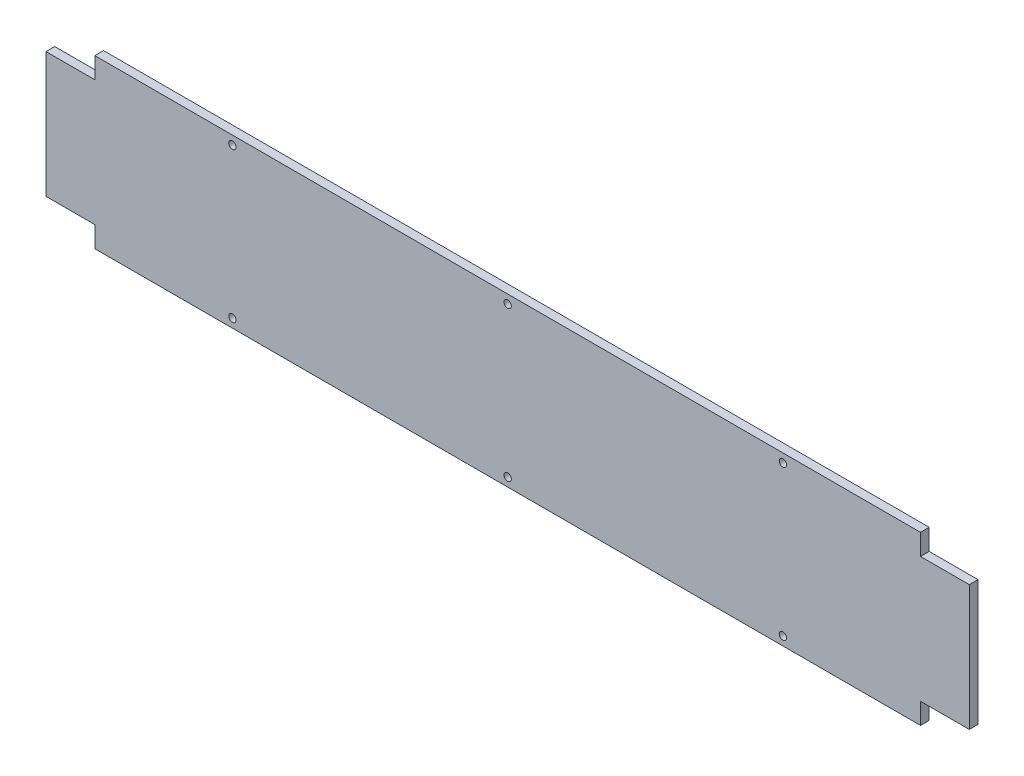
ISO-10303-21;
HEADER;
FILE_DESCRIPTION(('STEP AP214'),'2;1');
FILE_NAME('part.step','',(''),(''),'','','');
FILE_SCHEMA(('AUTOMOTIVE_DESIGN { 1 0 10303 214 1 1 1 1 }'));
ENDSEC;
DATA;
#1=APPLICATION_CONTEXT('core data for automotive mechanical design processes');
#2=APPLICATION_PROTOCOL_DEFINITION('international standard','automotive_design',2000,#1);
#3=PRODUCT_CONTEXT('',#1,'mechanical');
#4=PRODUCT('Part','Part','',(#3));
#5=PRODUCT_RELATED_PRODUCT_CATEGORY('part','',(#4));
#6=PRODUCT_DEFINITION_FORMATION('','',#4);
#7=PRODUCT_DEFINITION_CONTEXT('part definition',#1,'design');
#8=PRODUCT_DEFINITION('design','',#6,#7);
#9=PRODUCT_DEFINITION_SHAPE('','',#8);
#10=(LENGTH_UNIT() NAMED_UNIT(*) SI_UNIT(.MILLI.,.METRE.));
#11=(NAMED_UNIT(*) PLANE_ANGLE_UNIT() SI_UNIT($,.RADIAN.));
#12=(NAMED_UNIT(*) SI_UNIT($,.STERADIAN.) SOLID_ANGLE_UNIT());
#13=UNCERTAINTY_MEASURE_WITH_UNIT(LENGTH_MEASURE(1.E-05),#10,'distance_accuracy_value','');
#14=(GEOMETRIC_REPRESENTATION_CONTEXT(3) GLOBAL_UNCERTAINTY_ASSIGNED_CONTEXT((#13)) GLOBAL_UNIT_ASSIGNED_CONTEXT((#10,
#11,#12)) REPRESENTATION_CONTEXT('',''));
#15=CARTESIAN_POINT('',(0.,0.,0.));
#16=DIRECTION('',(0.,0.,1.));
#17=DIRECTION('',(1.,0.,0.));
#18=AXIS2_PLACEMENT_3D('',#15,#16,#17);
#19=CARTESIAN_POINT('',(0.,0.,5.));
#20=DIRECTION('',(1.,0.,0.));
#21=DIRECTION('',(0.,0.,-1.));
#22=AXIS2_PLACEMENT_3D('',#19,#20,#21);
#23=PLANE('',#22);
#24=DIRECTION('',(0.,0.,1.));
#25=VECTOR('',#24,1.);
#26=CARTESIAN_POINT('',(0.,12.,0.));
#27=LINE('',#26,#25);
#28=CARTESIAN_POINT('',(0.,12.,0.));
#29=VERTEX_POINT('',#28);
#30=CARTESIAN_POINT('',(0.,12.,5.));
#31=VERTEX_POINT('',#30);
#32=EDGE_CURVE('E135',#29,#31,#27,.T.);
#33=ORIENTED_EDGE('',*,*,#32,.F.);
#34=DIRECTION('',(0.,-1.,0.));
#35=VECTOR('',#34,1.);
#36=CARTESIAN_POINT('',(0.,0.,0.));
#37=LINE('',#36,#35);
#38=CARTESIAN_POINT('',(0.,0.,0.));
#39=VERTEX_POINT('',#38);
#40=EDGE_CURVE('E188',#29,#39,#37,.T.);
#41=ORIENTED_EDGE('',*,*,#40,.T.);
#42=DIRECTION('',(0.,0.,-1.));
#43=VECTOR('',#42,1.);
#44=CARTESIAN_POINT('',(0.,0.,5.));
#45=LINE('',#44,#43);
#46=CARTESIAN_POINT('',(0.,0.,5.));
#47=VERTEX_POINT('',#46);
#48=EDGE_CURVE('E11',#47,#39,#45,.T.);
#49=ORIENTED_EDGE('',*,*,#48,.F.);
#50=DIRECTION('',(0.,-1.,0.));
#51=VECTOR('',#50,1.);
#52=CARTESIAN_POINT('',(0.,0.,5.));
#53=LINE('',#52,#51);
#54=EDGE_CURVE('E151',#31,#47,#53,.T.);
#55=ORIENTED_EDGE('',*,*,#54,.F.);
#56=EDGE_LOOP('',(#33,#41,#49,#55));
#57=FACE_BOUND('',#56,.T.);
#58=ADVANCED_FACE('F45',(#57),#23,.F.);
#59=CARTESIAN_POINT('',(474.,0.,5.));
#60=DIRECTION('',(-1.,0.,0.));
#61=DIRECTION('',(0.,0.,1.));
#62=AXIS2_PLACEMENT_3D('',#59,#60,#61);
#63=PLANE('',#62);
#64=DIRECTION('',(0.,0.,1.));
#65=VECTOR('',#64,1.);
#66=CARTESIAN_POINT('',(474.,84.,0.));
#67=LINE('',#66,#65);
#68=CARTESIAN_POINT('',(474.,84.,0.));
#69=VERTEX_POINT('',#68);
#70=CARTESIAN_POINT('',(474.,84.,5.));
#71=VERTEX_POINT('',#70);
#72=EDGE_CURVE('E241',#69,#71,#67,.T.);
#73=ORIENTED_EDGE('',*,*,#72,.F.);
#74=DIRECTION('',(0.,1.,0.));
#75=VECTOR('',#74,1.);
#76=CARTESIAN_POINT('',(474.,0.,0.));
#77=LINE('',#76,#75);
#78=CARTESIAN_POINT('',(474.,96.,0.));
#79=VERTEX_POINT('',#78);
#80=EDGE_CURVE('E191',#69,#79,#77,.T.);
#81=ORIENTED_EDGE('',*,*,#80,.T.);
#82=DIRECTION('',(0.,0.,-1.));
#83=VECTOR('',#82,1.);
#84=CARTESIAN_POINT('',(474.,96.,5.));
#85=LINE('',#84,#83);
#86=CARTESIAN_POINT('',(474.,96.,5.));
#87=VERTEX_POINT('',#86);
#88=EDGE_CURVE('E198',#87,#79,#85,.T.);
#89=ORIENTED_EDGE('',*,*,#88,.F.);
#90=DIRECTION('',(0.,1.,0.));
#91=VECTOR('',#90,1.);
#92=CARTESIAN_POINT('',(474.,0.,5.));
#93=LINE('',#92,#91);
#94=EDGE_CURVE('E174',#71,#87,#93,.T.);
#95=ORIENTED_EDGE('',*,*,#94,.F.);
#96=EDGE_LOOP('',(#73,#81,#89,#95));
#97=FACE_BOUND('',#96,.T.);
#98=ADVANCED_FACE('F320',(#97),#63,.F.);
#99=CARTESIAN_POINT('',(0.,96.,0.));
#100=VERTEX_POINT('',#99);
#101=CARTESIAN_POINT('',(0.,84.,0.));
#102=VERTEX_POINT('',#101);
#103=EDGE_CURVE('E183',#100,#102,#37,.T.);
#104=ORIENTED_EDGE('',*,*,#103,.T.);
#105=DIRECTION('',(0.,0.,1.));
#106=VECTOR('',#105,1.);
#107=CARTESIAN_POINT('',(0.,84.,0.));
#108=LINE('',#107,#106);
#109=CARTESIAN_POINT('',(0.,84.,5.));
#110=VERTEX_POINT('',#109);
#111=EDGE_CURVE('E334',#102,#110,#108,.T.);
#112=ORIENTED_EDGE('',*,*,#111,.T.);
#113=CARTESIAN_POINT('',(0.,96.,5.));
#114=VERTEX_POINT('',#113);
#115=EDGE_CURVE('E160',#114,#110,#53,.T.);
#116=ORIENTED_EDGE('',*,*,#115,.F.);
#117=DIRECTION('',(0.,0.,-1.));
#118=VECTOR('',#117,1.);
#119=CARTESIAN_POINT('',(0.,96.,5.));
#120=LINE('',#119,#118);
#121=EDGE_CURVE('E182',#114,#100,#120,.T.);
#122=ORIENTED_EDGE('',*,*,#121,.T.);
#123=EDGE_LOOP('',(#104,#112,#116,#122));
#124=FACE_BOUND('',#123,.T.);
#125=ADVANCED_FACE('F47',(#124),#23,.F.);
#126=CARTESIAN_POINT('',(0.,0.,5.));
#127=DIRECTION('',(0.,1.,0.));
#128=DIRECTION('',(0.,0.,1.));
#129=AXIS2_PLACEMENT_3D('',#126,#127,#128);
#130=PLANE('',#129);
#131=DIRECTION('',(1.,0.,0.));
#132=VECTOR('',#131,1.);
#133=CARTESIAN_POINT('',(0.,0.,0.));
#134=LINE('',#133,#132);
#135=CARTESIAN_POINT('',(474.,0.,0.));
#136=VERTEX_POINT('',#135);
#137=EDGE_CURVE('E187',#39,#136,#134,.T.);
#138=ORIENTED_EDGE('',*,*,#137,.T.);
#139=DIRECTION('',(0.,0.,-1.));
#140=VECTOR('',#139,1.);
#141=CARTESIAN_POINT('',(474.,0.,5.));
#142=LINE('',#141,#140);
#143=CARTESIAN_POINT('',(474.,0.,5.));
#144=VERTEX_POINT('',#143);
#145=EDGE_CURVE('E54',#144,#136,#142,.T.);
#146=ORIENTED_EDGE('',*,*,#145,.F.);
#147=DIRECTION('',(1.,0.,0.));
#148=VECTOR('',#147,1.);
#149=CARTESIAN_POINT('',(0.,0.,5.));
#150=LINE('',#149,#148);
#151=EDGE_CURVE('E165',#47,#144,#150,.T.);
#152=ORIENTED_EDGE('',*,*,#151,.F.);
#153=ORIENTED_EDGE('',*,*,#48,.T.);
#154=EDGE_LOOP('',(#138,#146,#152,#153));
#155=FACE_BOUND('',#154,.T.);
#156=ADVANCED_FACE('F328',(#155),#130,.F.);
#157=CARTESIAN_POINT('',(474.,12.,0.));
#158=VERTEX_POINT('',#157);
#159=EDGE_CURVE('E166',#136,#158,#77,.T.);
#160=ORIENTED_EDGE('',*,*,#159,.T.);
#161=DIRECTION('',(0.,0.,1.));
#162=VECTOR('',#161,1.);
#163=CARTESIAN_POINT('',(474.,12.,0.));
#164=LINE('',#163,#162);
#165=CARTESIAN_POINT('',(474.,12.,5.));
#166=VERTEX_POINT('',#165);
#167=EDGE_CURVE('E235',#158,#166,#164,.T.);
#168=ORIENTED_EDGE('',*,*,#167,.T.);
#169=EDGE_CURVE('E175',#144,#166,#93,.T.);
#170=ORIENTED_EDGE('',*,*,#169,.F.);
#171=ORIENTED_EDGE('',*,*,#145,.T.);
#172=EDGE_LOOP('',(#160,#168,#170,#171));
#173=FACE_BOUND('',#172,.T.);
#174=ADVANCED_FACE('F207',(#173),#63,.F.);
#175=CARTESIAN_POINT('',(0.,96.,5.));
#176=DIRECTION('',(0.,-1.,0.));
#177=DIRECTION('',(0.,0.,-1.));
#178=AXIS2_PLACEMENT_3D('',#175,#176,#177);
#179=PLANE('',#178);
#180=DIRECTION('',(-1.,0.,0.));
#181=VECTOR('',#180,1.);
#182=CARTESIAN_POINT('',(0.,96.,0.));
#183=LINE('',#182,#181);
#184=EDGE_CURVE('E161',#79,#100,#183,.T.);
#185=ORIENTED_EDGE('',*,*,#184,.T.);
#186=ORIENTED_EDGE('',*,*,#121,.F.);
#187=DIRECTION('',(-1.,0.,0.));
#188=VECTOR('',#187,1.);
#189=CARTESIAN_POINT('',(0.,96.,5.));
#190=LINE('',#189,#188);
#191=EDGE_CURVE('E179',#87,#114,#190,.T.);
#192=ORIENTED_EDGE('',*,*,#191,.F.);
#193=ORIENTED_EDGE('',*,*,#88,.T.);
#194=EDGE_LOOP('',(#185,#186,#192,#193));
#195=FACE_BOUND('',#194,.T.);
#196=ADVANCED_FACE('F304',(#195),#179,.F.);
#197=CARTESIAN_POINT('',(0.,0.,5.));
#198=DIRECTION('',(0.,0.,-1.));
#199=DIRECTION('',(-1.,0.,0.));
#200=AXIS2_PLACEMENT_3D('',#197,#198,#199);
#201=PLANE('',#200);
#202=CARTESIAN_POINT('',(79.,5.,5.));
#203=DIRECTION('',(0.,0.,1.));
#204=DIRECTION('',(-1.,0.,0.));
#205=AXIS2_PLACEMENT_3D('',#202,#203,#204);
#206=CIRCLE('',#205,2.09999999999999);
#207=CARTESIAN_POINT('',(76.9,5.,5.));
#208=VERTEX_POINT('',#207);
#209=EDGE_CURVE('E285',#208,#208,#206,.T.);
#210=ORIENTED_EDGE('',*,*,#209,.F.);
#211=EDGE_LOOP('',(#210));
#212=FACE_BOUND('',#211,.T.);
#213=CARTESIAN_POINT('',(237.,5.,5.));
#214=DIRECTION('',(0.,0.,1.));
#215=DIRECTION('',(-1.,0.,0.));
#216=AXIS2_PLACEMENT_3D('',#213,#214,#215);
#217=CIRCLE('',#216,2.10000000000002);
#218=CARTESIAN_POINT('',(234.9,5.,5.));
#219=VERTEX_POINT('',#218);
#220=EDGE_CURVE('E277',#219,#219,#217,.T.);
#221=ORIENTED_EDGE('',*,*,#220,.F.);
#222=EDGE_LOOP('',(#221));
#223=FACE_BOUND('',#222,.T.);
#224=CARTESIAN_POINT('',(395.,5.,5.));
#225=DIRECTION('',(0.,0.,1.));
#226=DIRECTION('',(-1.,0.,0.));
#227=AXIS2_PLACEMENT_3D('',#224,#225,#226);
#228=CIRCLE('',#227,2.09999999999999);
#229=CARTESIAN_POINT('',(392.9,5.,5.));
#230=VERTEX_POINT('',#229);
#231=EDGE_CURVE('E269',#230,#230,#228,.T.);
#232=ORIENTED_EDGE('',*,*,#231,.F.);
#233=EDGE_LOOP('',(#232));
#234=FACE_BOUND('',#233,.T.);
#235=CARTESIAN_POINT('',(395.,91.,5.));
#236=DIRECTION('',(0.,0.,1.));
#237=DIRECTION('',(1.,0.,0.));
#238=AXIS2_PLACEMENT_3D('',#235,#236,#237);
#239=CIRCLE('',#238,2.09999999999999);
#240=CARTESIAN_POINT('',(397.1,91.,5.));
#241=VERTEX_POINT('',#240);
#242=EDGE_CURVE('E261',#241,#241,#239,.T.);
#243=ORIENTED_EDGE('',*,*,#242,.F.);
#244=EDGE_LOOP('',(#243));
#245=FACE_BOUND('',#244,.T.);
#246=CARTESIAN_POINT('',(237.,91.,5.));
#247=DIRECTION('',(0.,0.,1.));
#248=DIRECTION('',(1.,0.,0.));
#249=AXIS2_PLACEMENT_3D('',#246,#247,#248);
#250=CIRCLE('',#249,2.10000000000002);
#251=CARTESIAN_POINT('',(239.1,91.,5.));
#252=VERTEX_POINT('',#251);
#253=EDGE_CURVE('E253',#252,#252,#250,.T.);
#254=ORIENTED_EDGE('',*,*,#253,.F.);
#255=EDGE_LOOP('',(#254));
#256=FACE_BOUND('',#255,.T.);
#257=CARTESIAN_POINT('',(79.,91.,5.));
#258=DIRECTION('',(0.,0.,1.));
#259=DIRECTION('',(1.,0.,0.));
#260=AXIS2_PLACEMENT_3D('',#257,#258,#259);
#261=CIRCLE('',#260,2.09999999999999);
#262=CARTESIAN_POINT('',(81.1,91.,5.));
#263=VERTEX_POINT('',#262);
#264=EDGE_CURVE('E170',#263,#263,#261,.T.);
#265=ORIENTED_EDGE('',*,*,#264,.F.);
#266=EDGE_LOOP('',(#265));
#267=FACE_BOUND('',#266,.T.);
#268=ORIENTED_EDGE('',*,*,#115,.T.);
#269=DIRECTION('',(-1.,0.,0.));
#270=VECTOR('',#269,1.);
#271=CARTESIAN_POINT('',(0.,84.,5.));
#272=LINE('',#271,#270);
#273=CARTESIAN_POINT('',(-28.,84.,5.));
#274=VERTEX_POINT('',#273);
#275=EDGE_CURVE('E61',#110,#274,#272,.T.);
#276=ORIENTED_EDGE('',*,*,#275,.T.);
#277=DIRECTION('',(0.,-1.,0.));
#278=VECTOR('',#277,1.);
#279=CARTESIAN_POINT('',(-28.,84.,5.));
#280=LINE('',#279,#278);
#281=CARTESIAN_POINT('',(-28.,12.,5.));
#282=VERTEX_POINT('',#281);
#283=EDGE_CURVE('E154',#274,#282,#280,.T.);
#284=ORIENTED_EDGE('',*,*,#283,.T.);
#285=DIRECTION('',(1.,0.,0.));
#286=VECTOR('',#285,1.);
#287=CARTESIAN_POINT('',(0.,12.,5.));
#288=LINE('',#287,#286);
#289=EDGE_CURVE('E138',#282,#31,#288,.T.);
#290=ORIENTED_EDGE('',*,*,#289,.T.);
#291=ORIENTED_EDGE('',*,*,#54,.T.);
#292=ORIENTED_EDGE('',*,*,#151,.T.);
#293=ORIENTED_EDGE('',*,*,#169,.T.);
#294=DIRECTION('',(1.,0.,0.));
#295=VECTOR('',#294,1.);
#296=CARTESIAN_POINT('',(474.,12.,5.));
#297=LINE('',#296,#295);
#298=CARTESIAN_POINT('',(502.,12.,5.));
#299=VERTEX_POINT('',#298);
#300=EDGE_CURVE('E69',#166,#299,#297,.T.);
#301=ORIENTED_EDGE('',*,*,#300,.T.);
#302=DIRECTION('',(0.,1.,0.));
#303=VECTOR('',#302,1.);
#304=CARTESIAN_POINT('',(502.,84.,5.));
#305=LINE('',#304,#303);
#306=CARTESIAN_POINT('',(502.,84.,5.));
#307=VERTEX_POINT('',#306);
#308=EDGE_CURVE('E228',#299,#307,#305,.T.);
#309=ORIENTED_EDGE('',*,*,#308,.T.);
#310=DIRECTION('',(-1.,0.,0.));
#311=VECTOR('',#310,1.);
#312=CARTESIAN_POINT('',(474.,84.,5.));
#313=LINE('',#312,#311);
#314=EDGE_CURVE('E221',#307,#71,#313,.T.);
#315=ORIENTED_EDGE('',*,*,#314,.T.);
#316=ORIENTED_EDGE('',*,*,#94,.T.);
#317=ORIENTED_EDGE('',*,*,#191,.T.);
#318=EDGE_LOOP('',(#268,#276,#284,#290,#291,#292,#293,#301,#309,#315,#316,#317));
#319=FACE_BOUND('',#318,.T.);
#320=ADVANCED_FACE('F150',(#212,#223,#234,#245,#256,#267,#319),#201,.F.);
#321=CARTESIAN_POINT('',(0.,0.,0.));
#322=DIRECTION('',(0.,0.,-1.));
#323=DIRECTION('',(-1.,0.,0.));
#324=AXIS2_PLACEMENT_3D('',#321,#322,#323);
#325=PLANE('',#324);
#326=CARTESIAN_POINT('',(79.,5.,0.));
#327=DIRECTION('',(0.,0.,1.));
#328=DIRECTION('',(-1.,0.,0.));
#329=AXIS2_PLACEMENT_3D('',#326,#327,#328);
#330=CIRCLE('',#329,2.09999999999999);
#331=CARTESIAN_POINT('',(76.9,5.,0.));
#332=VERTEX_POINT('',#331);
#333=EDGE_CURVE('E244',#332,#332,#330,.T.);
#334=ORIENTED_EDGE('',*,*,#333,.T.);
#335=EDGE_LOOP('',(#334));
#336=FACE_BOUND('',#335,.T.);
#337=CARTESIAN_POINT('',(237.,5.,0.));
#338=DIRECTION('',(0.,0.,1.));
#339=DIRECTION('',(-1.,0.,0.));
#340=AXIS2_PLACEMENT_3D('',#337,#338,#339);
#341=CIRCLE('',#340,2.10000000000002);
#342=CARTESIAN_POINT('',(234.9,5.,0.));
#343=VERTEX_POINT('',#342);
#344=EDGE_CURVE('E281',#343,#343,#341,.T.);
#345=ORIENTED_EDGE('',*,*,#344,.T.);
#346=EDGE_LOOP('',(#345));
#347=FACE_BOUND('',#346,.T.);
#348=CARTESIAN_POINT('',(395.,5.,0.));
#349=DIRECTION('',(0.,0.,1.));
#350=DIRECTION('',(-1.,0.,0.));
#351=AXIS2_PLACEMENT_3D('',#348,#349,#350);
#352=CIRCLE('',#351,2.09999999999999);
#353=CARTESIAN_POINT('',(392.9,5.,0.));
#354=VERTEX_POINT('',#353);
#355=EDGE_CURVE('E273',#354,#354,#352,.T.);
#356=ORIENTED_EDGE('',*,*,#355,.T.);
#357=EDGE_LOOP('',(#356));
#358=FACE_BOUND('',#357,.T.);
#359=CARTESIAN_POINT('',(395.,91.,0.));
#360=DIRECTION('',(0.,0.,1.));
#361=DIRECTION('',(1.,0.,0.));
#362=AXIS2_PLACEMENT_3D('',#359,#360,#361);
#363=CIRCLE('',#362,2.09999999999999);
#364=CARTESIAN_POINT('',(397.1,91.,0.));
#365=VERTEX_POINT('',#364);
#366=EDGE_CURVE('E265',#365,#365,#363,.T.);
#367=ORIENTED_EDGE('',*,*,#366,.T.);
#368=EDGE_LOOP('',(#367));
#369=FACE_BOUND('',#368,.T.);
#370=CARTESIAN_POINT('',(237.,91.,0.));
#371=DIRECTION('',(0.,0.,1.));
#372=DIRECTION('',(1.,0.,0.));
#373=AXIS2_PLACEMENT_3D('',#370,#371,#372);
#374=CIRCLE('',#373,2.10000000000002);
#375=CARTESIAN_POINT('',(239.1,91.,0.));
#376=VERTEX_POINT('',#375);
#377=EDGE_CURVE('E257',#376,#376,#374,.T.);
#378=ORIENTED_EDGE('',*,*,#377,.T.);
#379=EDGE_LOOP('',(#378));
#380=FACE_BOUND('',#379,.T.);
#381=CARTESIAN_POINT('',(79.,91.,0.));
#382=DIRECTION('',(0.,0.,1.));
#383=DIRECTION('',(1.,0.,0.));
#384=AXIS2_PLACEMENT_3D('',#381,#382,#383);
#385=CIRCLE('',#384,2.09999999999999);
#386=CARTESIAN_POINT('',(81.1,91.,0.));
#387=VERTEX_POINT('',#386);
#388=EDGE_CURVE('E291',#387,#387,#385,.T.);
#389=ORIENTED_EDGE('',*,*,#388,.T.);
#390=EDGE_LOOP('',(#389));
#391=FACE_BOUND('',#390,.T.);
#392=ORIENTED_EDGE('',*,*,#103,.F.);
#393=ORIENTED_EDGE('',*,*,#184,.F.);
#394=ORIENTED_EDGE('',*,*,#80,.F.);
#395=DIRECTION('',(-1.,0.,0.));
#396=VECTOR('',#395,1.);
#397=CARTESIAN_POINT('',(474.,84.,0.));
#398=LINE('',#397,#396);
#399=CARTESIAN_POINT('',(502.,84.,0.));
#400=VERTEX_POINT('',#399);
#401=EDGE_CURVE('E225',#400,#69,#398,.T.);
#402=ORIENTED_EDGE('',*,*,#401,.F.);
#403=DIRECTION('',(0.,1.,0.));
#404=VECTOR('',#403,1.);
#405=CARTESIAN_POINT('',(502.,84.,0.));
#406=LINE('',#405,#404);
#407=CARTESIAN_POINT('',(502.,12.,0.));
#408=VERTEX_POINT('',#407);
#409=EDGE_CURVE('E219',#408,#400,#406,.T.);
#410=ORIENTED_EDGE('',*,*,#409,.F.);
#411=DIRECTION('',(1.,0.,0.));
#412=VECTOR('',#411,1.);
#413=CARTESIAN_POINT('',(474.,12.,0.));
#414=LINE('',#413,#412);
#415=EDGE_CURVE('E216',#158,#408,#414,.T.);
#416=ORIENTED_EDGE('',*,*,#415,.F.);
#417=ORIENTED_EDGE('',*,*,#159,.F.);
#418=ORIENTED_EDGE('',*,*,#137,.F.);
#419=ORIENTED_EDGE('',*,*,#40,.F.);
#420=DIRECTION('',(1.,0.,0.));
#421=VECTOR('',#420,1.);
#422=CARTESIAN_POINT('',(0.,12.,0.));
#423=LINE('',#422,#421);
#424=CARTESIAN_POINT('',(-28.,12.,0.));
#425=VERTEX_POINT('',#424);
#426=EDGE_CURVE('E140',#425,#29,#423,.T.);
#427=ORIENTED_EDGE('',*,*,#426,.F.);
#428=DIRECTION('',(0.,-1.,0.));
#429=VECTOR('',#428,1.);
#430=CARTESIAN_POINT('',(-28.,84.,0.));
#431=LINE('',#430,#429);
#432=CARTESIAN_POINT('',(-28.,84.,0.));
#433=VERTEX_POINT('',#432);
#434=EDGE_CURVE('E342',#433,#425,#431,.T.);
#435=ORIENTED_EDGE('',*,*,#434,.F.);
#436=DIRECTION('',(-1.,0.,0.));
#437=VECTOR('',#436,1.);
#438=CARTESIAN_POINT('',(0.,84.,0.));
#439=LINE('',#438,#437);
#440=EDGE_CURVE('E156',#102,#433,#439,.T.);
#441=ORIENTED_EDGE('',*,*,#440,.F.);
#442=EDGE_LOOP('',(#392,#393,#394,#402,#410,#416,#417,#418,#419,#427,#435,#441));
#443=FACE_BOUND('',#442,.T.);
#444=ADVANCED_FACE('F213',(#336,#347,#358,#369,#380,#391,#443),#325,.T.);
#445=CARTESIAN_POINT('',(79.,91.,0.));
#446=DIRECTION('',(0.,0.,1.));
#447=DIRECTION('',(1.,0.,0.));
#448=AXIS2_PLACEMENT_3D('',#445,#446,#447);
#449=CYLINDRICAL_SURFACE('',#448,2.09999999999999);
#450=ORIENTED_EDGE('',*,*,#388,.F.);
#451=EDGE_LOOP('',(#450));
#452=FACE_BOUND('',#451,.T.);
#453=ORIENTED_EDGE('',*,*,#264,.T.);
#454=EDGE_LOOP('',(#453));
#455=FACE_BOUND('',#454,.T.);
#456=ADVANCED_FACE('F301',(#452,#455),#449,.F.);
#457=CARTESIAN_POINT('',(237.,91.,0.));
#458=DIRECTION('',(0.,0.,1.));
#459=DIRECTION('',(1.,0.,0.));
#460=AXIS2_PLACEMENT_3D('',#457,#458,#459);
#461=CYLINDRICAL_SURFACE('',#460,2.10000000000002);
#462=ORIENTED_EDGE('',*,*,#377,.F.);
#463=EDGE_LOOP('',(#462));
#464=FACE_BOUND('',#463,.T.);
#465=ORIENTED_EDGE('',*,*,#253,.T.);
#466=EDGE_LOOP('',(#465));
#467=FACE_BOUND('',#466,.T.);
#468=ADVANCED_FACE('F383',(#464,#467),#461,.F.);
#469=CARTESIAN_POINT('',(395.,91.,0.));
#470=DIRECTION('',(0.,0.,1.));
#471=DIRECTION('',(1.,0.,0.));
#472=AXIS2_PLACEMENT_3D('',#469,#470,#471);
#473=CYLINDRICAL_SURFACE('',#472,2.09999999999999);
#474=ORIENTED_EDGE('',*,*,#366,.F.);
#475=EDGE_LOOP('',(#474));
#476=FACE_BOUND('',#475,.T.);
#477=ORIENTED_EDGE('',*,*,#242,.T.);
#478=EDGE_LOOP('',(#477));
#479=FACE_BOUND('',#478,.T.);
#480=ADVANCED_FACE('F386',(#476,#479),#473,.F.);
#481=CARTESIAN_POINT('',(395.,5.,0.));
#482=DIRECTION('',(0.,0.,1.));
#483=DIRECTION('',(1.,0.,0.));
#484=AXIS2_PLACEMENT_3D('',#481,#482,#483);
#485=CYLINDRICAL_SURFACE('',#484,2.09999999999999);
#486=ORIENTED_EDGE('',*,*,#355,.F.);
#487=EDGE_LOOP('',(#486));
#488=FACE_BOUND('',#487,.T.);
#489=ORIENTED_EDGE('',*,*,#231,.T.);
#490=EDGE_LOOP('',(#489));
#491=FACE_BOUND('',#490,.T.);
#492=ADVANCED_FACE('F390',(#488,#491),#485,.F.);
#493=CARTESIAN_POINT('',(237.,5.,0.));
#494=DIRECTION('',(0.,0.,1.));
#495=DIRECTION('',(1.,0.,0.));
#496=AXIS2_PLACEMENT_3D('',#493,#494,#495);
#497=CYLINDRICAL_SURFACE('',#496,2.10000000000002);
#498=ORIENTED_EDGE('',*,*,#344,.F.);
#499=EDGE_LOOP('',(#498));
#500=FACE_BOUND('',#499,.T.);
#501=ORIENTED_EDGE('',*,*,#220,.T.);
#502=EDGE_LOOP('',(#501));
#503=FACE_BOUND('',#502,.T.);
#504=ADVANCED_FACE('F394',(#500,#503),#497,.F.);
#505=CARTESIAN_POINT('',(79.,5.,0.));
#506=DIRECTION('',(0.,0.,1.));
#507=DIRECTION('',(1.,0.,0.));
#508=AXIS2_PLACEMENT_3D('',#505,#506,#507);
#509=CYLINDRICAL_SURFACE('',#508,2.09999999999999);
#510=ORIENTED_EDGE('',*,*,#333,.F.);
#511=EDGE_LOOP('',(#510));
#512=FACE_BOUND('',#511,.T.);
#513=ORIENTED_EDGE('',*,*,#209,.T.);
#514=EDGE_LOOP('',(#513));
#515=FACE_BOUND('',#514,.T.);
#516=ADVANCED_FACE('F398',(#512,#515),#509,.F.);
#517=CARTESIAN_POINT('',(474.,84.,0.));
#518=DIRECTION('',(0.,1.,0.));
#519=DIRECTION('',(-1.,0.,0.));
#520=AXIS2_PLACEMENT_3D('',#517,#518,#519);
#521=PLANE('',#520);
#522=ORIENTED_EDGE('',*,*,#314,.F.);
#523=DIRECTION('',(0.,0.,1.));
#524=VECTOR('',#523,1.);
#525=CARTESIAN_POINT('',(502.,84.,0.));
#526=LINE('',#525,#524);
#527=EDGE_CURVE('E245',#400,#307,#526,.T.);
#528=ORIENTED_EDGE('',*,*,#527,.F.);
#529=ORIENTED_EDGE('',*,*,#401,.T.);
#530=ORIENTED_EDGE('',*,*,#72,.T.);
#531=EDGE_LOOP('',(#522,#528,#529,#530));
#532=FACE_BOUND('',#531,.T.);
#533=ADVANCED_FACE('F368',(#532),#521,.T.);
#534=CARTESIAN_POINT('',(502.,84.,0.));
#535=DIRECTION('',(1.,0.,0.));
#536=DIRECTION('',(0.,0.,-1.));
#537=AXIS2_PLACEMENT_3D('',#534,#535,#536);
#538=PLANE('',#537);
#539=ORIENTED_EDGE('',*,*,#308,.F.);
#540=DIRECTION('',(0.,0.,1.));
#541=VECTOR('',#540,1.);
#542=CARTESIAN_POINT('',(502.,12.,0.));
#543=LINE('',#542,#541);
#544=EDGE_CURVE('E248',#408,#299,#543,.T.);
#545=ORIENTED_EDGE('',*,*,#544,.F.);
#546=ORIENTED_EDGE('',*,*,#409,.T.);
#547=ORIENTED_EDGE('',*,*,#527,.T.);
#548=EDGE_LOOP('',(#539,#545,#546,#547));
#549=FACE_BOUND('',#548,.T.);
#550=ADVANCED_FACE('F371',(#549),#538,.T.);
#551=CARTESIAN_POINT('',(474.,12.,0.));
#552=DIRECTION('',(0.,-1.,0.));
#553=DIRECTION('',(1.,0.,0.));
#554=AXIS2_PLACEMENT_3D('',#551,#552,#553);
#555=PLANE('',#554);
#556=ORIENTED_EDGE('',*,*,#300,.F.);
#557=ORIENTED_EDGE('',*,*,#167,.F.);
#558=ORIENTED_EDGE('',*,*,#415,.T.);
#559=ORIENTED_EDGE('',*,*,#544,.T.);
#560=EDGE_LOOP('',(#556,#557,#558,#559));
#561=FACE_BOUND('',#560,.T.);
#562=ADVANCED_FACE('F372',(#561),#555,.T.);
#563=CARTESIAN_POINT('',(0.,12.,0.));
#564=DIRECTION('',(0.,-1.,0.));
#565=DIRECTION('',(0.,0.,-1.));
#566=AXIS2_PLACEMENT_3D('',#563,#564,#565);
#567=PLANE('',#566);
#568=ORIENTED_EDGE('',*,*,#289,.F.);
#569=DIRECTION('',(0.,0.,1.));
#570=VECTOR('',#569,1.);
#571=CARTESIAN_POINT('',(-28.,12.,0.));
#572=LINE('',#571,#570);
#573=EDGE_CURVE('E145',#425,#282,#572,.T.);
#574=ORIENTED_EDGE('',*,*,#573,.F.);
#575=ORIENTED_EDGE('',*,*,#426,.T.);
#576=ORIENTED_EDGE('',*,*,#32,.T.);
#577=EDGE_LOOP('',(#568,#574,#575,#576));
#578=FACE_BOUND('',#577,.T.);
#579=ADVANCED_FACE('F137',(#578),#567,.T.);
#580=CARTESIAN_POINT('',(-28.,84.,0.));
#581=DIRECTION('',(-1.,0.,0.));
#582=DIRECTION('',(0.,-1.,0.));
#583=AXIS2_PLACEMENT_3D('',#580,#581,#582);
#584=PLANE('',#583);
#585=ORIENTED_EDGE('',*,*,#283,.F.);
#586=DIRECTION('',(0.,0.,1.));
#587=VECTOR('',#586,1.);
#588=CARTESIAN_POINT('',(-28.,84.,0.));
#589=LINE('',#588,#587);
#590=EDGE_CURVE('E355',#433,#274,#589,.T.);
#591=ORIENTED_EDGE('',*,*,#590,.F.);
#592=ORIENTED_EDGE('',*,*,#434,.T.);
#593=ORIENTED_EDGE('',*,*,#573,.T.);
#594=EDGE_LOOP('',(#585,#591,#592,#593));
#595=FACE_BOUND('',#594,.T.);
#596=ADVANCED_FACE('F360',(#595),#584,.T.);
#597=CARTESIAN_POINT('',(0.,84.,0.));
#598=DIRECTION('',(0.,1.,0.));
#599=DIRECTION('',(0.,0.,1.));
#600=AXIS2_PLACEMENT_3D('',#597,#598,#599);
#601=PLANE('',#600);
#602=ORIENTED_EDGE('',*,*,#275,.F.);
#603=ORIENTED_EDGE('',*,*,#111,.F.);
#604=ORIENTED_EDGE('',*,*,#440,.T.);
#605=ORIENTED_EDGE('',*,*,#590,.T.);
#606=EDGE_LOOP('',(#602,#603,#604,#605));
#607=FACE_BOUND('',#606,.T.);
#608=ADVANCED_FACE('F359',(#607),#601,.T.);
#609=CLOSED_SHELL('',(#58,#98,#125,#156,#174,#196,#320,#444,#456,#468,#480,#492,#504,#516,#533,
#550,#562,#579,#596,#608));
#610=MANIFOLD_SOLID_BREP('B2',#609);
#611=ADVANCED_BREP_SHAPE_REPRESENTATION('',(#18,#610),#14);
#612=SHAPE_DEFINITION_REPRESENTATION(#9,#611);
ENDSEC;
END-ISO-10303-21;
